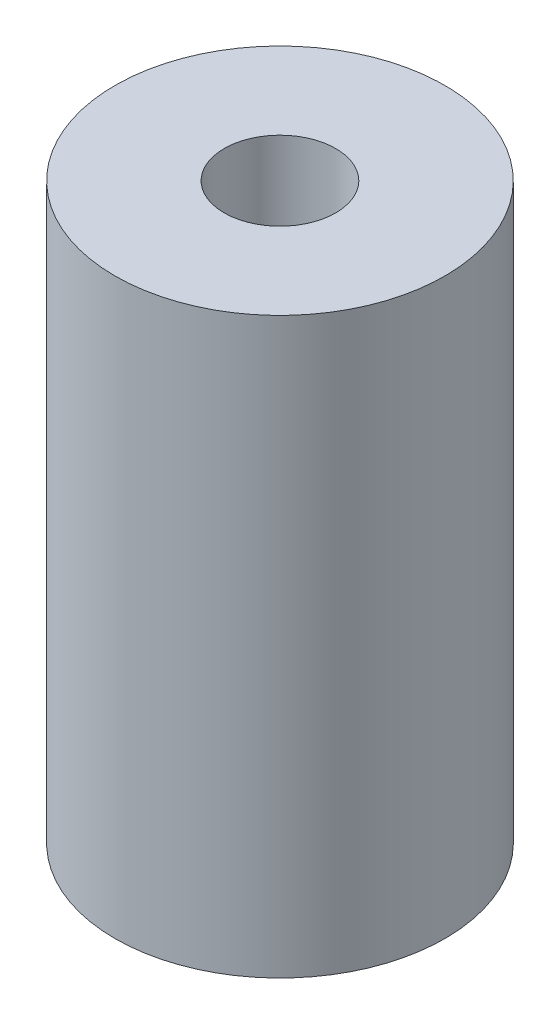
ISO-10303-21;
HEADER;
FILE_DESCRIPTION(('STEP AP214'),'2;1');
FILE_NAME('part.step','',(''),(''),'','','');
FILE_SCHEMA(('AUTOMOTIVE_DESIGN { 1 0 10303 214 1 1 1 1 }'));
ENDSEC;
DATA;
#1=APPLICATION_CONTEXT('core data for automotive mechanical design processes');
#2=APPLICATION_PROTOCOL_DEFINITION('international standard','automotive_design',2000,#1);
#3=PRODUCT_CONTEXT('',#1,'mechanical');
#4=PRODUCT('Part','Part','',(#3));
#5=PRODUCT_RELATED_PRODUCT_CATEGORY('part','',(#4));
#6=PRODUCT_DEFINITION_FORMATION('','',#4);
#7=PRODUCT_DEFINITION_CONTEXT('part definition',#1,'design');
#8=PRODUCT_DEFINITION('design','',#6,#7);
#9=PRODUCT_DEFINITION_SHAPE('','',#8);
#10=(LENGTH_UNIT() NAMED_UNIT(*) SI_UNIT(.MILLI.,.METRE.));
#11=(NAMED_UNIT(*) PLANE_ANGLE_UNIT() SI_UNIT($,.RADIAN.));
#12=(NAMED_UNIT(*) SI_UNIT($,.STERADIAN.) SOLID_ANGLE_UNIT());
#13=UNCERTAINTY_MEASURE_WITH_UNIT(LENGTH_MEASURE(1.E-05),#10,'distance_accuracy_value','');
#14=(GEOMETRIC_REPRESENTATION_CONTEXT(3) GLOBAL_UNCERTAINTY_ASSIGNED_CONTEXT((#13)) GLOBAL_UNIT_ASSIGNED_CONTEXT((#10,
#11,#12)) REPRESENTATION_CONTEXT('',''));
#15=CARTESIAN_POINT('',(0.,0.,0.));
#16=DIRECTION('',(0.,0.,1.));
#17=DIRECTION('',(1.,0.,0.));
#18=AXIS2_PLACEMENT_3D('',#15,#16,#17);
#19=CARTESIAN_POINT('',(0.,228.6,0.));
#20=DIRECTION('',(0.,1.,0.));
#21=DIRECTION('',(0.,0.,1.));
#22=AXIS2_PLACEMENT_3D('',#19,#20,#21);
#23=PLANE('',#22);
#24=CARTESIAN_POINT('',(0.,228.6,0.));
#25=DIRECTION('',(0.,1.,0.));
#26=DIRECTION('',(0.,0.,1.));
#27=AXIS2_PLACEMENT_3D('',#24,#25,#26);
#28=CIRCLE('',#27,65.7225);
#29=CARTESIAN_POINT('',(0.,228.6,65.7225));
#30=VERTEX_POINT('',#29);
#31=EDGE_CURVE('E10',#30,#30,#28,.T.);
#32=ORIENTED_EDGE('',*,*,#31,.T.);
#33=EDGE_LOOP('',(#32));
#34=FACE_BOUND('',#33,.T.);
#35=CARTESIAN_POINT('',(0.,228.6,0.));
#36=DIRECTION('',(0.,1.,0.));
#37=DIRECTION('',(0.,0.,1.));
#38=AXIS2_PLACEMENT_3D('',#35,#36,#37);
#39=CIRCLE('',#38,22.225);
#40=CARTESIAN_POINT('',(0.,228.6,22.225));
#41=VERTEX_POINT('',#40);
#42=EDGE_CURVE('E45',#41,#41,#39,.T.);
#43=ORIENTED_EDGE('',*,*,#42,.F.);
#44=EDGE_LOOP('',(#43));
#45=FACE_BOUND('',#44,.T.);
#46=ADVANCED_FACE('F34',(#34,#45),#23,.T.);
#47=CARTESIAN_POINT('',(0.,0.,0.));
#48=DIRECTION('',(0.,1.,0.));
#49=DIRECTION('',(0.,0.,1.));
#50=AXIS2_PLACEMENT_3D('',#47,#48,#49);
#51=PLANE('',#50);
#52=CARTESIAN_POINT('',(0.,0.,0.));
#53=DIRECTION('',(0.,1.,0.));
#54=DIRECTION('',(0.,0.,1.));
#55=AXIS2_PLACEMENT_3D('',#52,#53,#54);
#56=CIRCLE('',#55,65.7225);
#57=CARTESIAN_POINT('',(0.,0.,65.7225));
#58=VERTEX_POINT('',#57);
#59=EDGE_CURVE('E38',#58,#58,#56,.T.);
#60=ORIENTED_EDGE('',*,*,#59,.F.);
#61=EDGE_LOOP('',(#60));
#62=FACE_BOUND('',#61,.T.);
#63=CARTESIAN_POINT('',(0.,0.,0.));
#64=DIRECTION('',(0.,1.,0.));
#65=DIRECTION('',(0.,0.,1.));
#66=AXIS2_PLACEMENT_3D('',#63,#64,#65);
#67=CIRCLE('',#66,22.225);
#68=CARTESIAN_POINT('',(0.,0.,22.225));
#69=VERTEX_POINT('',#68);
#70=EDGE_CURVE('E47',#69,#69,#67,.T.);
#71=ORIENTED_EDGE('',*,*,#70,.T.);
#72=EDGE_LOOP('',(#71));
#73=FACE_BOUND('',#72,.T.);
#74=ADVANCED_FACE('F57',(#62,#73),#51,.F.);
#75=CARTESIAN_POINT('',(0.,228.6,0.));
#76=DIRECTION('',(0.,-1.,0.));
#77=DIRECTION('',(0.,0.,-1.));
#78=AXIS2_PLACEMENT_3D('',#75,#76,#77);
#79=CYLINDRICAL_SURFACE('',#78,65.7225);
#80=ORIENTED_EDGE('',*,*,#31,.F.);
#81=EDGE_LOOP('',(#80));
#82=FACE_BOUND('',#81,.T.);
#83=ORIENTED_EDGE('',*,*,#59,.T.);
#84=EDGE_LOOP('',(#83));
#85=FACE_BOUND('',#84,.T.);
#86=ADVANCED_FACE('F36',(#82,#85),#79,.T.);
#87=CARTESIAN_POINT('',(0.,228.6,0.));
#88=DIRECTION('',(0.,-1.,0.));
#89=DIRECTION('',(0.,0.,-1.));
#90=AXIS2_PLACEMENT_3D('',#87,#88,#89);
#91=CYLINDRICAL_SURFACE('',#90,22.225);
#92=ORIENTED_EDGE('',*,*,#42,.T.);
#93=EDGE_LOOP('',(#92));
#94=FACE_BOUND('',#93,.T.);
#95=ORIENTED_EDGE('',*,*,#70,.F.);
#96=EDGE_LOOP('',(#95));
#97=FACE_BOUND('',#96,.T.);
#98=ADVANCED_FACE('F53',(#94,#97),#91,.F.);
#99=CLOSED_SHELL('',(#46,#74,#86,#98));
#100=MANIFOLD_SOLID_BREP('B2',#99);
#101=ADVANCED_BREP_SHAPE_REPRESENTATION('',(#18,#100),#14);
#102=SHAPE_DEFINITION_REPRESENTATION(#9,#101);
ENDSEC;
END-ISO-10303-21;
